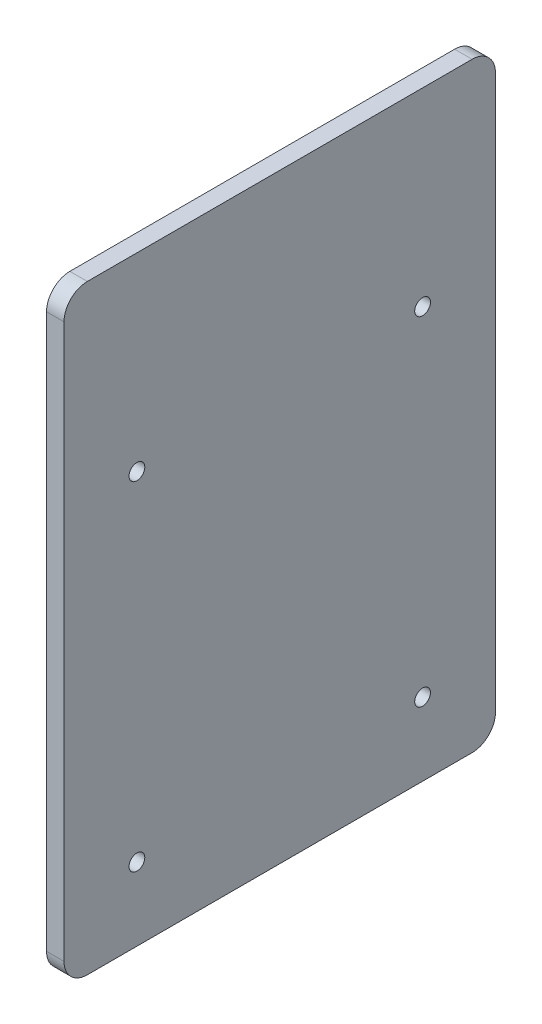
ISO-10303-21;
HEADER;
FILE_DESCRIPTION(('STEP AP214'),'2;1');
FILE_NAME('part.step','',(''),(''),'','','');
FILE_SCHEMA(('AUTOMOTIVE_DESIGN { 1 0 10303 214 1 1 1 1 }'));
ENDSEC;
DATA;
#1=APPLICATION_CONTEXT('core data for automotive mechanical design processes');
#2=APPLICATION_PROTOCOL_DEFINITION('international standard','automotive_design',2000,#1);
#3=PRODUCT_CONTEXT('',#1,'mechanical');
#4=PRODUCT('Part','Part','',(#3));
#5=PRODUCT_RELATED_PRODUCT_CATEGORY('part','',(#4));
#6=PRODUCT_DEFINITION_FORMATION('','',#4);
#7=PRODUCT_DEFINITION_CONTEXT('part definition',#1,'design');
#8=PRODUCT_DEFINITION('design','',#6,#7);
#9=PRODUCT_DEFINITION_SHAPE('','',#8);
#10=(LENGTH_UNIT() NAMED_UNIT(*) SI_UNIT(.MILLI.,.METRE.));
#11=(NAMED_UNIT(*) PLANE_ANGLE_UNIT() SI_UNIT($,.RADIAN.));
#12=(NAMED_UNIT(*) SI_UNIT($,.STERADIAN.) SOLID_ANGLE_UNIT());
#13=UNCERTAINTY_MEASURE_WITH_UNIT(LENGTH_MEASURE(1.E-05),#10,'distance_accuracy_value','');
#14=(GEOMETRIC_REPRESENTATION_CONTEXT(3) GLOBAL_UNCERTAINTY_ASSIGNED_CONTEXT((#13)) GLOBAL_UNIT_ASSIGNED_CONTEXT((#10,
#11,#12)) REPRESENTATION_CONTEXT('',''));
#15=CARTESIAN_POINT('',(0.,0.,0.));
#16=DIRECTION('',(0.,0.,1.));
#17=DIRECTION('',(1.,0.,0.));
#18=AXIS2_PLACEMENT_3D('',#15,#16,#17);
#19=CARTESIAN_POINT('',(-3.,0.,0.));
#20=DIRECTION('',(1.,0.,0.));
#21=DIRECTION('',(0.,0.,-1.));
#22=AXIS2_PLACEMENT_3D('',#19,#20,#21);
#23=PLANE('',#22);
#24=CARTESIAN_POINT('',(-3.,-29.,24.5));
#25=DIRECTION('',(1.,0.,0.));
#26=DIRECTION('',(0.,0.,-1.));
#27=AXIS2_PLACEMENT_3D('',#24,#25,#26);
#28=CIRCLE('',#27,1.35);
#29=CARTESIAN_POINT('',(-3.,-29.,23.15));
#30=VERTEX_POINT('',#29);
#31=EDGE_CURVE('E204',#30,#30,#28,.T.);
#32=ORIENTED_EDGE('',*,*,#31,.T.);
#33=EDGE_LOOP('',(#32));
#34=FACE_BOUND('',#33,.T.);
#35=CARTESIAN_POINT('',(-3.,-29.,-24.5));
#36=DIRECTION('',(1.,0.,0.));
#37=DIRECTION('',(0.,0.,-1.));
#38=AXIS2_PLACEMENT_3D('',#35,#36,#37);
#39=CIRCLE('',#38,1.35);
#40=CARTESIAN_POINT('',(-3.,-29.,-25.85));
#41=VERTEX_POINT('',#40);
#42=EDGE_CURVE('E134',#41,#41,#39,.F.);
#43=ORIENTED_EDGE('',*,*,#42,.F.);
#44=EDGE_LOOP('',(#43));
#45=FACE_BOUND('',#44,.T.);
#46=DIRECTION('',(0.,0.,-1.));
#47=VECTOR('',#46,1.);
#48=CARTESIAN_POINT('',(-3.,-41.5,37.));
#49=LINE('',#48,#47);
#50=CARTESIAN_POINT('',(-3.,-41.5,33.));
#51=VERTEX_POINT('',#50);
#52=CARTESIAN_POINT('',(-3.,-41.5,-33.));
#53=VERTEX_POINT('',#52);
#54=EDGE_CURVE('E182',#51,#53,#49,.T.);
#55=ORIENTED_EDGE('',*,*,#54,.F.);
#56=CARTESIAN_POINT('',(-3.,-37.5,33.));
#57=DIRECTION('',(1.,0.,0.));
#58=DIRECTION('',(0.,0.,-1.));
#59=AXIS2_PLACEMENT_3D('',#56,#57,#58);
#60=CIRCLE('',#59,4.);
#61=CARTESIAN_POINT('',(-3.,-37.5,37.));
#62=VERTEX_POINT('',#61);
#63=EDGE_CURVE('E160',#51,#62,#60,.F.);
#64=ORIENTED_EDGE('',*,*,#63,.T.);
#65=DIRECTION('',(0.,-1.,0.));
#66=VECTOR('',#65,1.);
#67=CARTESIAN_POINT('',(-3.,61.5,37.));
#68=LINE('',#67,#66);
#69=CARTESIAN_POINT('',(-3.,57.5,37.));
#70=VERTEX_POINT('',#69);
#71=EDGE_CURVE('E178',#70,#62,#68,.T.);
#72=ORIENTED_EDGE('',*,*,#71,.F.);
#73=CARTESIAN_POINT('',(-3.,57.5,33.));
#74=DIRECTION('',(1.,0.,0.));
#75=DIRECTION('',(0.,0.,-1.));
#76=AXIS2_PLACEMENT_3D('',#73,#74,#75);
#77=CIRCLE('',#76,4.);
#78=CARTESIAN_POINT('',(-3.,61.5,33.));
#79=VERTEX_POINT('',#78);
#80=EDGE_CURVE('E138',#70,#79,#77,.F.);
#81=ORIENTED_EDGE('',*,*,#80,.T.);
#82=DIRECTION('',(0.,0.,-1.));
#83=VECTOR('',#82,1.);
#84=CARTESIAN_POINT('',(-3.,61.5,37.));
#85=LINE('',#84,#83);
#86=CARTESIAN_POINT('',(-3.,61.5,-33.));
#87=VERTEX_POINT('',#86);
#88=EDGE_CURVE('E139',#79,#87,#85,.T.);
#89=ORIENTED_EDGE('',*,*,#88,.T.);
#90=CARTESIAN_POINT('',(-3.,57.5,-33.));
#91=DIRECTION('',(1.,0.,0.));
#92=DIRECTION('',(0.,0.,-1.));
#93=AXIS2_PLACEMENT_3D('',#90,#91,#92);
#94=CIRCLE('',#93,4.);
#95=CARTESIAN_POINT('',(-3.,57.5,-37.));
#96=VERTEX_POINT('',#95);
#97=EDGE_CURVE('E66',#87,#96,#94,.F.);
#98=ORIENTED_EDGE('',*,*,#97,.T.);
#99=DIRECTION('',(0.,-1.,0.));
#100=VECTOR('',#99,1.);
#101=CARTESIAN_POINT('',(-3.,61.5,-37.));
#102=LINE('',#101,#100);
#103=CARTESIAN_POINT('',(-3.,-37.5,-37.));
#104=VERTEX_POINT('',#103);
#105=EDGE_CURVE('E143',#96,#104,#102,.T.);
#106=ORIENTED_EDGE('',*,*,#105,.T.);
#107=CARTESIAN_POINT('',(-3.,-37.5,-33.));
#108=DIRECTION('',(1.,0.,0.));
#109=DIRECTION('',(0.,0.,-1.));
#110=AXIS2_PLACEMENT_3D('',#107,#108,#109);
#111=CIRCLE('',#110,4.);
#112=EDGE_CURVE('E156',#104,#53,#111,.F.);
#113=ORIENTED_EDGE('',*,*,#112,.T.);
#114=EDGE_LOOP('',(#55,#64,#72,#81,#89,#98,#106,#113));
#115=FACE_BOUND('',#114,.T.);
#116=CARTESIAN_POINT('',(-3.,29.,24.5));
#117=DIRECTION('',(-1.,0.,0.));
#118=DIRECTION('',(0.,0.,1.));
#119=AXIS2_PLACEMENT_3D('',#116,#117,#118);
#120=CIRCLE('',#119,1.35);
#121=CARTESIAN_POINT('',(-3.,29.,25.85));
#122=VERTEX_POINT('',#121);
#123=EDGE_CURVE('E198',#122,#122,#120,.T.);
#124=ORIENTED_EDGE('',*,*,#123,.F.);
#125=EDGE_LOOP('',(#124));
#126=FACE_BOUND('',#125,.T.);
#127=CARTESIAN_POINT('',(-3.,29.,-24.5));
#128=DIRECTION('',(1.,0.,0.));
#129=DIRECTION('',(0.,0.,-1.));
#130=AXIS2_PLACEMENT_3D('',#127,#128,#129);
#131=CIRCLE('',#130,1.34999999999999);
#132=CARTESIAN_POINT('',(-3.,29.,-25.85));
#133=VERTEX_POINT('',#132);
#134=EDGE_CURVE('E192',#133,#133,#131,.T.);
#135=ORIENTED_EDGE('',*,*,#134,.T.);
#136=EDGE_LOOP('',(#135));
#137=FACE_BOUND('',#136,.T.);
#138=ADVANCED_FACE('F45',(#34,#45,#115,#126,#137),#23,.F.);
#139=CARTESIAN_POINT('',(0.,0.,0.));
#140=DIRECTION('',(1.,0.,0.));
#141=DIRECTION('',(0.,0.,-1.));
#142=AXIS2_PLACEMENT_3D('',#139,#140,#141);
#143=PLANE('',#142);
#144=CARTESIAN_POINT('',(0.,29.,24.5));
#145=DIRECTION('',(-1.,0.,0.));
#146=DIRECTION('',(0.,0.,1.));
#147=AXIS2_PLACEMENT_3D('',#144,#145,#146);
#148=CIRCLE('',#147,1.35);
#149=CARTESIAN_POINT('',(0.,29.,25.85));
#150=VERTEX_POINT('',#149);
#151=EDGE_CURVE('E201',#150,#150,#148,.T.);
#152=ORIENTED_EDGE('',*,*,#151,.T.);
#153=EDGE_LOOP('',(#152));
#154=FACE_BOUND('',#153,.T.);
#155=CARTESIAN_POINT('',(0.,-29.,-24.5));
#156=DIRECTION('',(1.,0.,0.));
#157=DIRECTION('',(0.,0.,-1.));
#158=AXIS2_PLACEMENT_3D('',#155,#156,#157);
#159=CIRCLE('',#158,1.35);
#160=CARTESIAN_POINT('',(0.,-29.,-25.85));
#161=VERTEX_POINT('',#160);
#162=EDGE_CURVE('E186',#161,#161,#159,.F.);
#163=ORIENTED_EDGE('',*,*,#162,.T.);
#164=EDGE_LOOP('',(#163));
#165=FACE_BOUND('',#164,.T.);
#166=DIRECTION('',(0.,-1.,0.));
#167=VECTOR('',#166,1.);
#168=CARTESIAN_POINT('',(0.,61.5,37.));
#169=LINE('',#168,#167);
#170=CARTESIAN_POINT('',(0.,57.5,37.));
#171=VERTEX_POINT('',#170);
#172=CARTESIAN_POINT('',(0.,-37.5,37.));
#173=VERTEX_POINT('',#172);
#174=EDGE_CURVE('E115',#171,#173,#169,.T.);
#175=ORIENTED_EDGE('',*,*,#174,.T.);
#176=CARTESIAN_POINT('',(0.,-37.5,33.));
#177=DIRECTION('',(1.,0.,0.));
#178=DIRECTION('',(0.,0.,-1.));
#179=AXIS2_PLACEMENT_3D('',#176,#177,#178);
#180=CIRCLE('',#179,4.);
#181=CARTESIAN_POINT('',(0.,-41.5,33.));
#182=VERTEX_POINT('',#181);
#183=EDGE_CURVE('E122',#173,#182,#180,.T.);
#184=ORIENTED_EDGE('',*,*,#183,.T.);
#185=DIRECTION('',(0.,0.,-1.));
#186=VECTOR('',#185,1.);
#187=CARTESIAN_POINT('',(0.,-41.5,37.));
#188=LINE('',#187,#186);
#189=CARTESIAN_POINT('',(0.,-41.5,-33.));
#190=VERTEX_POINT('',#189);
#191=EDGE_CURVE('E133',#182,#190,#188,.T.);
#192=ORIENTED_EDGE('',*,*,#191,.T.);
#193=CARTESIAN_POINT('',(0.,-37.5,-33.));
#194=DIRECTION('',(1.,0.,0.));
#195=DIRECTION('',(0.,0.,-1.));
#196=AXIS2_PLACEMENT_3D('',#193,#194,#195);
#197=CIRCLE('',#196,4.);
#198=CARTESIAN_POINT('',(0.,-37.5,-37.));
#199=VERTEX_POINT('',#198);
#200=EDGE_CURVE('E141',#190,#199,#197,.T.);
#201=ORIENTED_EDGE('',*,*,#200,.T.);
#202=DIRECTION('',(0.,-1.,0.));
#203=VECTOR('',#202,1.);
#204=CARTESIAN_POINT('',(0.,61.5,-37.));
#205=LINE('',#204,#203);
#206=CARTESIAN_POINT('',(0.,57.5,-37.));
#207=VERTEX_POINT('',#206);
#208=EDGE_CURVE('E176',#207,#199,#205,.T.);
#209=ORIENTED_EDGE('',*,*,#208,.F.);
#210=CARTESIAN_POINT('',(0.,57.5,-33.));
#211=DIRECTION('',(1.,0.,0.));
#212=DIRECTION('',(0.,0.,-1.));
#213=AXIS2_PLACEMENT_3D('',#210,#211,#212);
#214=CIRCLE('',#213,4.);
#215=CARTESIAN_POINT('',(0.,61.5,-33.));
#216=VERTEX_POINT('',#215);
#217=EDGE_CURVE('E123',#207,#216,#214,.T.);
#218=ORIENTED_EDGE('',*,*,#217,.T.);
#219=DIRECTION('',(0.,0.,-1.));
#220=VECTOR('',#219,1.);
#221=CARTESIAN_POINT('',(0.,61.5,37.));
#222=LINE('',#221,#220);
#223=CARTESIAN_POINT('',(0.,61.5,33.));
#224=VERTEX_POINT('',#223);
#225=EDGE_CURVE('E117',#224,#216,#222,.T.);
#226=ORIENTED_EDGE('',*,*,#225,.F.);
#227=CARTESIAN_POINT('',(0.,57.5,33.));
#228=DIRECTION('',(1.,0.,0.));
#229=DIRECTION('',(0.,0.,-1.));
#230=AXIS2_PLACEMENT_3D('',#227,#228,#229);
#231=CIRCLE('',#230,4.);
#232=EDGE_CURVE('E111',#224,#171,#231,.T.);
#233=ORIENTED_EDGE('',*,*,#232,.T.);
#234=EDGE_LOOP('',(#175,#184,#192,#201,#209,#218,#226,#233));
#235=FACE_BOUND('',#234,.T.);
#236=CARTESIAN_POINT('',(0.,-29.,24.5));
#237=DIRECTION('',(1.,0.,0.));
#238=DIRECTION('',(0.,0.,-1.));
#239=AXIS2_PLACEMENT_3D('',#236,#237,#238);
#240=CIRCLE('',#239,1.35);
#241=CARTESIAN_POINT('',(0.,-29.,23.15));
#242=VERTEX_POINT('',#241);
#243=EDGE_CURVE('E189',#242,#242,#240,.T.);
#244=ORIENTED_EDGE('',*,*,#243,.F.);
#245=EDGE_LOOP('',(#244));
#246=FACE_BOUND('',#245,.T.);
#247=CARTESIAN_POINT('',(0.,29.,-24.5));
#248=DIRECTION('',(1.,0.,0.));
#249=DIRECTION('',(0.,0.,-1.));
#250=AXIS2_PLACEMENT_3D('',#247,#248,#249);
#251=CIRCLE('',#250,1.34999999999999);
#252=CARTESIAN_POINT('',(0.,29.,-25.85));
#253=VERTEX_POINT('',#252);
#254=EDGE_CURVE('E195',#253,#253,#251,.T.);
#255=ORIENTED_EDGE('',*,*,#254,.F.);
#256=EDGE_LOOP('',(#255));
#257=FACE_BOUND('',#256,.T.);
#258=ADVANCED_FACE('F113',(#154,#165,#235,#246,#257),#143,.T.);
#259=CARTESIAN_POINT('',(-3.,61.5,37.));
#260=DIRECTION('',(0.,0.,1.));
#261=DIRECTION('',(0.,-1.,0.));
#262=AXIS2_PLACEMENT_3D('',#259,#260,#261);
#263=PLANE('',#262);
#264=ORIENTED_EDGE('',*,*,#71,.T.);
#265=DIRECTION('',(1.,0.,0.));
#266=VECTOR('',#265,1.);
#267=CARTESIAN_POINT('',(-3.,-37.5,37.));
#268=LINE('',#267,#266);
#269=EDGE_CURVE('E132',#62,#173,#268,.T.);
#270=ORIENTED_EDGE('',*,*,#269,.T.);
#271=ORIENTED_EDGE('',*,*,#174,.F.);
#272=DIRECTION('',(1.,0.,0.));
#273=VECTOR('',#272,1.);
#274=CARTESIAN_POINT('',(-3.,57.5,37.));
#275=LINE('',#274,#273);
#276=EDGE_CURVE('E129',#171,#70,#275,.F.);
#277=ORIENTED_EDGE('',*,*,#276,.T.);
#278=EDGE_LOOP('',(#264,#270,#271,#277));
#279=FACE_BOUND('',#278,.T.);
#280=ADVANCED_FACE('F128',(#279),#263,.T.);
#281=CARTESIAN_POINT('',(-3.,61.5,37.));
#282=DIRECTION('',(0.,-1.,0.));
#283=DIRECTION('',(0.,0.,-1.));
#284=AXIS2_PLACEMENT_3D('',#281,#282,#283);
#285=PLANE('',#284);
#286=ORIENTED_EDGE('',*,*,#88,.F.);
#287=DIRECTION('',(1.,0.,0.));
#288=VECTOR('',#287,1.);
#289=CARTESIAN_POINT('',(0.,61.5,33.));
#290=LINE('',#289,#288);
#291=EDGE_CURVE('E164',#79,#224,#290,.T.);
#292=ORIENTED_EDGE('',*,*,#291,.T.);
#293=ORIENTED_EDGE('',*,*,#225,.T.);
#294=DIRECTION('',(1.,0.,0.));
#295=VECTOR('',#294,1.);
#296=CARTESIAN_POINT('',(-3.,61.5,-33.));
#297=LINE('',#296,#295);
#298=EDGE_CURVE('E162',#216,#87,#297,.F.);
#299=ORIENTED_EDGE('',*,*,#298,.T.);
#300=EDGE_LOOP('',(#286,#292,#293,#299));
#301=FACE_BOUND('',#300,.T.);
#302=ADVANCED_FACE('F167',(#301),#285,.F.);
#303=CARTESIAN_POINT('',(-3.,61.5,-37.));
#304=DIRECTION('',(0.,0.,1.));
#305=DIRECTION('',(0.,-1.,0.));
#306=AXIS2_PLACEMENT_3D('',#303,#304,#305);
#307=PLANE('',#306);
#308=ORIENTED_EDGE('',*,*,#105,.F.);
#309=DIRECTION('',(1.,0.,0.));
#310=VECTOR('',#309,1.);
#311=CARTESIAN_POINT('',(-3.,57.5,-37.));
#312=LINE('',#311,#310);
#313=EDGE_CURVE('E11',#96,#207,#312,.T.);
#314=ORIENTED_EDGE('',*,*,#313,.T.);
#315=ORIENTED_EDGE('',*,*,#208,.T.);
#316=DIRECTION('',(1.,0.,0.));
#317=VECTOR('',#316,1.);
#318=CARTESIAN_POINT('',(-3.,-37.5,-37.));
#319=LINE('',#318,#317);
#320=EDGE_CURVE('E53',#199,#104,#319,.F.);
#321=ORIENTED_EDGE('',*,*,#320,.T.);
#322=EDGE_LOOP('',(#308,#314,#315,#321));
#323=FACE_BOUND('',#322,.T.);
#324=ADVANCED_FACE('F175',(#323),#307,.F.);
#325=CARTESIAN_POINT('',(-3.,-41.5,37.));
#326=DIRECTION('',(0.,-1.,0.));
#327=DIRECTION('',(0.,0.,-1.));
#328=AXIS2_PLACEMENT_3D('',#325,#326,#327);
#329=PLANE('',#328);
#330=ORIENTED_EDGE('',*,*,#191,.F.);
#331=DIRECTION('',(1.,0.,0.));
#332=VECTOR('',#331,1.);
#333=CARTESIAN_POINT('',(-3.,-41.5,33.));
#334=LINE('',#333,#332);
#335=EDGE_CURVE('E154',#182,#51,#334,.F.);
#336=ORIENTED_EDGE('',*,*,#335,.T.);
#337=ORIENTED_EDGE('',*,*,#54,.T.);
#338=DIRECTION('',(1.,0.,0.));
#339=VECTOR('',#338,1.);
#340=CARTESIAN_POINT('',(0.,-41.5,-33.));
#341=LINE('',#340,#339);
#342=EDGE_CURVE('E151',#53,#190,#341,.T.);
#343=ORIENTED_EDGE('',*,*,#342,.T.);
#344=EDGE_LOOP('',(#330,#336,#337,#343));
#345=FACE_BOUND('',#344,.T.);
#346=ADVANCED_FACE('F245',(#345),#329,.T.);
#347=CARTESIAN_POINT('',(-3.,-29.,-24.5));
#348=DIRECTION('',(1.,0.,0.));
#349=DIRECTION('',(0.,0.,-1.));
#350=AXIS2_PLACEMENT_3D('',#347,#348,#349);
#351=CYLINDRICAL_SURFACE('',#350,1.35);
#352=ORIENTED_EDGE('',*,*,#42,.T.);
#353=EDGE_LOOP('',(#352));
#354=FACE_BOUND('',#353,.T.);
#355=ORIENTED_EDGE('',*,*,#162,.F.);
#356=EDGE_LOOP('',(#355));
#357=FACE_BOUND('',#356,.T.);
#358=ADVANCED_FACE('F239',(#354,#357),#351,.F.);
#359=CARTESIAN_POINT('',(-3.,-29.,24.5));
#360=DIRECTION('',(1.,0.,0.));
#361=DIRECTION('',(0.,0.,-1.));
#362=AXIS2_PLACEMENT_3D('',#359,#360,#361);
#363=CYLINDRICAL_SURFACE('',#362,1.35);
#364=ORIENTED_EDGE('',*,*,#31,.F.);
#365=EDGE_LOOP('',(#364));
#366=FACE_BOUND('',#365,.T.);
#367=ORIENTED_EDGE('',*,*,#243,.T.);
#368=EDGE_LOOP('',(#367));
#369=FACE_BOUND('',#368,.T.);
#370=ADVANCED_FACE('F210',(#366,#369),#363,.F.);
#371=CARTESIAN_POINT('',(-3.,29.,24.5));
#372=DIRECTION('',(1.,0.,0.));
#373=DIRECTION('',(0.,0.,-1.));
#374=AXIS2_PLACEMENT_3D('',#371,#372,#373);
#375=CYLINDRICAL_SURFACE('',#374,1.35);
#376=ORIENTED_EDGE('',*,*,#123,.T.);
#377=EDGE_LOOP('',(#376));
#378=FACE_BOUND('',#377,.T.);
#379=ORIENTED_EDGE('',*,*,#151,.F.);
#380=EDGE_LOOP('',(#379));
#381=FACE_BOUND('',#380,.T.);
#382=ADVANCED_FACE('F220',(#378,#381),#375,.F.);
#383=CARTESIAN_POINT('',(-3.,29.,-24.5));
#384=DIRECTION('',(1.,0.,0.));
#385=DIRECTION('',(0.,0.,-1.));
#386=AXIS2_PLACEMENT_3D('',#383,#384,#385);
#387=CYLINDRICAL_SURFACE('',#386,1.34999999999999);
#388=ORIENTED_EDGE('',*,*,#134,.F.);
#389=EDGE_LOOP('',(#388));
#390=FACE_BOUND('',#389,.T.);
#391=ORIENTED_EDGE('',*,*,#254,.T.);
#392=EDGE_LOOP('',(#391));
#393=FACE_BOUND('',#392,.T.);
#394=ADVANCED_FACE('F217',(#390,#393),#387,.F.);
#395=CARTESIAN_POINT('',(-3.,-37.5,33.));
#396=DIRECTION('',(1.,0.,0.));
#397=DIRECTION('',(0.,0.,-1.));
#398=AXIS2_PLACEMENT_3D('',#395,#396,#397);
#399=CYLINDRICAL_SURFACE('',#398,4.);
#400=ORIENTED_EDGE('',*,*,#63,.F.);
#401=ORIENTED_EDGE('',*,*,#335,.F.);
#402=ORIENTED_EDGE('',*,*,#183,.F.);
#403=ORIENTED_EDGE('',*,*,#269,.F.);
#404=EDGE_LOOP('',(#400,#401,#402,#403));
#405=FACE_BOUND('',#404,.T.);
#406=ADVANCED_FACE('F219',(#405),#399,.T.);
#407=CARTESIAN_POINT('',(-3.,57.5,33.));
#408=DIRECTION('',(-1.,0.,0.));
#409=DIRECTION('',(0.,0.,1.));
#410=AXIS2_PLACEMENT_3D('',#407,#408,#409);
#411=CYLINDRICAL_SURFACE('',#410,4.);
#412=ORIENTED_EDGE('',*,*,#80,.F.);
#413=ORIENTED_EDGE('',*,*,#276,.F.);
#414=ORIENTED_EDGE('',*,*,#232,.F.);
#415=ORIENTED_EDGE('',*,*,#291,.F.);
#416=EDGE_LOOP('',(#412,#413,#414,#415));
#417=FACE_BOUND('',#416,.T.);
#418=ADVANCED_FACE('F137',(#417),#411,.T.);
#419=CARTESIAN_POINT('',(-3.,57.5,-33.));
#420=DIRECTION('',(1.,0.,0.));
#421=DIRECTION('',(0.,0.,-1.));
#422=AXIS2_PLACEMENT_3D('',#419,#420,#421);
#423=CYLINDRICAL_SURFACE('',#422,4.);
#424=ORIENTED_EDGE('',*,*,#97,.F.);
#425=ORIENTED_EDGE('',*,*,#298,.F.);
#426=ORIENTED_EDGE('',*,*,#217,.F.);
#427=ORIENTED_EDGE('',*,*,#313,.F.);
#428=EDGE_LOOP('',(#424,#425,#426,#427));
#429=FACE_BOUND('',#428,.T.);
#430=ADVANCED_FACE('F173',(#429),#423,.T.);
#431=CARTESIAN_POINT('',(-3.,-37.5,-33.));
#432=DIRECTION('',(-1.,0.,0.));
#433=DIRECTION('',(0.,0.,1.));
#434=AXIS2_PLACEMENT_3D('',#431,#432,#433);
#435=CYLINDRICAL_SURFACE('',#434,4.);
#436=ORIENTED_EDGE('',*,*,#112,.F.);
#437=ORIENTED_EDGE('',*,*,#320,.F.);
#438=ORIENTED_EDGE('',*,*,#200,.F.);
#439=ORIENTED_EDGE('',*,*,#342,.F.);
#440=EDGE_LOOP('',(#436,#437,#438,#439));
#441=FACE_BOUND('',#440,.T.);
#442=ADVANCED_FACE('F47',(#441),#435,.T.);
#443=CLOSED_SHELL('',(#138,#258,#280,#302,#324,#346,#358,#370,#382,#394,#406,#418,#430,#442));
#444=MANIFOLD_SOLID_BREP('B2',#443);
#445=ADVANCED_BREP_SHAPE_REPRESENTATION('',(#18,#444),#14);
#446=SHAPE_DEFINITION_REPRESENTATION(#9,#445);
ENDSEC;
END-ISO-10303-21;
